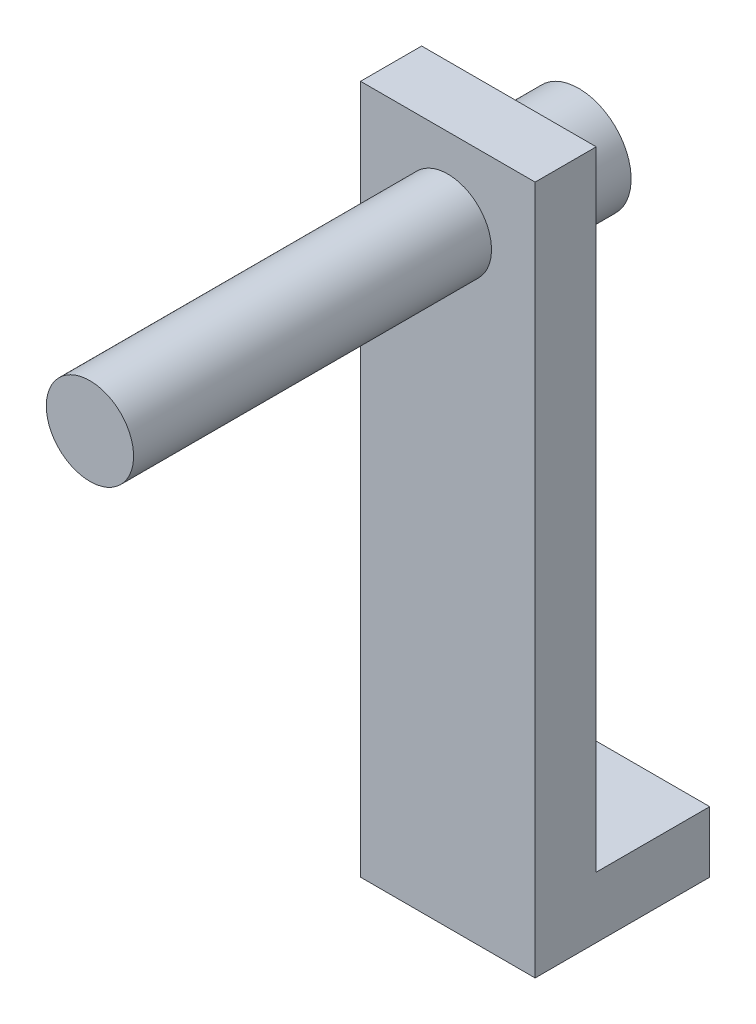
ISO-10303-21;
HEADER;
FILE_DESCRIPTION(('STEP AP214'),'2;1');
FILE_NAME('part.step','',(''),(''),'','','');
FILE_SCHEMA(('AUTOMOTIVE_DESIGN { 1 0 10303 214 1 1 1 1 }'));
ENDSEC;
DATA;
#1=APPLICATION_CONTEXT('core data for automotive mechanical design processes');
#2=APPLICATION_PROTOCOL_DEFINITION('international standard','automotive_design',2000,#1);
#3=PRODUCT_CONTEXT('',#1,'mechanical');
#4=PRODUCT('Part','Part','',(#3));
#5=PRODUCT_RELATED_PRODUCT_CATEGORY('part','',(#4));
#6=PRODUCT_DEFINITION_FORMATION('','',#4);
#7=PRODUCT_DEFINITION_CONTEXT('part definition',#1,'design');
#8=PRODUCT_DEFINITION('design','',#6,#7);
#9=PRODUCT_DEFINITION_SHAPE('','',#8);
#10=(LENGTH_UNIT() NAMED_UNIT(*) SI_UNIT(.MILLI.,.METRE.));
#11=(NAMED_UNIT(*) PLANE_ANGLE_UNIT() SI_UNIT($,.RADIAN.));
#12=(NAMED_UNIT(*) SI_UNIT($,.STERADIAN.) SOLID_ANGLE_UNIT());
#13=UNCERTAINTY_MEASURE_WITH_UNIT(LENGTH_MEASURE(1.E-05),#10,'distance_accuracy_value','');
#14=(GEOMETRIC_REPRESENTATION_CONTEXT(3) GLOBAL_UNCERTAINTY_ASSIGNED_CONTEXT((#13)) GLOBAL_UNIT_ASSIGNED_CONTEXT((#10,
#11,#12)) REPRESENTATION_CONTEXT('',''));
#15=CARTESIAN_POINT('',(0.,0.,0.));
#16=DIRECTION('',(0.,0.,1.));
#17=DIRECTION('',(1.,0.,0.));
#18=AXIS2_PLACEMENT_3D('',#15,#16,#17);
#19=CARTESIAN_POINT('',(-10.,7.,-10.));
#20=DIRECTION('',(1.,0.,0.));
#21=DIRECTION('',(0.,0.,-1.));
#22=AXIS2_PLACEMENT_3D('',#19,#20,#21);
#23=PLANE('',#22);
#24=DIRECTION('',(0.,0.,1.));
#25=VECTOR('',#24,1.);
#26=CARTESIAN_POINT('',(-10.,0.,-10.));
#27=LINE('',#26,#25);
#28=CARTESIAN_POINT('',(-10.,0.,-10.));
#29=VERTEX_POINT('',#28);
#30=CARTESIAN_POINT('',(-10.,0.,10.));
#31=VERTEX_POINT('',#30);
#32=EDGE_CURVE('E129',#29,#31,#27,.T.);
#33=ORIENTED_EDGE('',*,*,#32,.T.);
#34=DIRECTION('',(0.,-1.,0.));
#35=VECTOR('',#34,1.);
#36=CARTESIAN_POINT('',(-10.,7.,10.));
#37=LINE('',#36,#35);
#38=CARTESIAN_POINT('',(-10.,78.96,10.));
#39=VERTEX_POINT('',#38);
#40=EDGE_CURVE('E11',#39,#31,#37,.T.);
#41=ORIENTED_EDGE('',*,*,#40,.F.);
#42=DIRECTION('',(0.,0.,-1.));
#43=VECTOR('',#42,1.);
#44=CARTESIAN_POINT('',(-10.,78.96,10.));
#45=LINE('',#44,#43);
#46=CARTESIAN_POINT('',(-10.,78.96,3.));
#47=VERTEX_POINT('',#46);
#48=EDGE_CURVE('E109',#39,#47,#45,.T.);
#49=ORIENTED_EDGE('',*,*,#48,.T.);
#50=DIRECTION('',(0.,-1.,0.));
#51=VECTOR('',#50,1.);
#52=CARTESIAN_POINT('',(-10.,78.96,3.));
#53=LINE('',#52,#51);
#54=CARTESIAN_POINT('',(-10.,7.,3.));
#55=VERTEX_POINT('',#54);
#56=EDGE_CURVE('E124',#47,#55,#53,.T.);
#57=ORIENTED_EDGE('',*,*,#56,.T.);
#58=DIRECTION('',(0.,0.,1.));
#59=VECTOR('',#58,1.);
#60=CARTESIAN_POINT('',(-10.,7.,-10.));
#61=LINE('',#60,#59);
#62=CARTESIAN_POINT('',(-10.,7.,-10.));
#63=VERTEX_POINT('',#62);
#64=EDGE_CURVE('E61',#63,#55,#61,.T.);
#65=ORIENTED_EDGE('',*,*,#64,.F.);
#66=DIRECTION('',(0.,-1.,0.));
#67=VECTOR('',#66,1.);
#68=CARTESIAN_POINT('',(-10.,7.,-10.));
#69=LINE('',#68,#67);
#70=EDGE_CURVE('E136',#63,#29,#69,.T.);
#71=ORIENTED_EDGE('',*,*,#70,.T.);
#72=EDGE_LOOP('',(#33,#41,#49,#57,#65,#71));
#73=FACE_BOUND('',#72,.T.);
#74=ADVANCED_FACE('F42',(#73),#23,.F.);
#75=CARTESIAN_POINT('',(-10.,7.,10.));
#76=DIRECTION('',(0.,0.,-1.));
#77=DIRECTION('',(-1.,0.,0.));
#78=AXIS2_PLACEMENT_3D('',#75,#76,#77);
#79=PLANE('',#78);
#80=CARTESIAN_POINT('',(0.,69.76,10.));
#81=DIRECTION('',(0.,0.,-1.));
#82=DIRECTION('',(-1.,0.,0.));
#83=AXIS2_PLACEMENT_3D('',#80,#81,#82);
#84=CIRCLE('',#83,5.);
#85=CARTESIAN_POINT('',(-5.,69.76,10.));
#86=VERTEX_POINT('',#85);
#87=EDGE_CURVE('E114',#86,#86,#84,.T.);
#88=ORIENTED_EDGE('',*,*,#87,.T.);
#89=EDGE_LOOP('',(#88));
#90=FACE_BOUND('',#89,.T.);
#91=DIRECTION('',(1.,0.,0.));
#92=VECTOR('',#91,1.);
#93=CARTESIAN_POINT('',(-10.,0.,10.));
#94=LINE('',#93,#92);
#95=CARTESIAN_POINT('',(10.,0.,10.));
#96=VERTEX_POINT('',#95);
#97=EDGE_CURVE('E96',#31,#96,#94,.T.);
#98=ORIENTED_EDGE('',*,*,#97,.T.);
#99=DIRECTION('',(0.,-1.,0.));
#100=VECTOR('',#99,1.);
#101=CARTESIAN_POINT('',(10.,7.,10.));
#102=LINE('',#101,#100);
#103=CARTESIAN_POINT('',(10.,78.96,10.));
#104=VERTEX_POINT('',#103);
#105=EDGE_CURVE('E49',#104,#96,#102,.T.);
#106=ORIENTED_EDGE('',*,*,#105,.F.);
#107=DIRECTION('',(-1.,0.,0.));
#108=VECTOR('',#107,1.);
#109=CARTESIAN_POINT('',(10.,78.96,10.));
#110=LINE('',#109,#108);
#111=EDGE_CURVE('E94',#104,#39,#110,.T.);
#112=ORIENTED_EDGE('',*,*,#111,.T.);
#113=ORIENTED_EDGE('',*,*,#40,.T.);
#114=EDGE_LOOP('',(#98,#106,#112,#113));
#115=FACE_BOUND('',#114,.T.);
#116=ADVANCED_FACE('F93',(#90,#115),#79,.F.);
#117=CARTESIAN_POINT('',(10.,7.,-10.));
#118=DIRECTION('',(-1.,0.,0.));
#119=DIRECTION('',(0.,0.,1.));
#120=AXIS2_PLACEMENT_3D('',#117,#118,#119);
#121=PLANE('',#120);
#122=DIRECTION('',(0.,0.,-1.));
#123=VECTOR('',#122,1.);
#124=CARTESIAN_POINT('',(10.,7.,-10.));
#125=LINE('',#124,#123);
#126=CARTESIAN_POINT('',(10.,7.,3.));
#127=VERTEX_POINT('',#126);
#128=CARTESIAN_POINT('',(10.,7.,-10.));
#129=VERTEX_POINT('',#128);
#130=EDGE_CURVE('E131',#127,#129,#125,.T.);
#131=ORIENTED_EDGE('',*,*,#130,.F.);
#132=DIRECTION('',(0.,-1.,0.));
#133=VECTOR('',#132,1.);
#134=CARTESIAN_POINT('',(10.,78.96,3.));
#135=LINE('',#134,#133);
#136=CARTESIAN_POINT('',(10.,78.96,3.));
#137=VERTEX_POINT('',#136);
#138=EDGE_CURVE('E113',#137,#127,#135,.T.);
#139=ORIENTED_EDGE('',*,*,#138,.F.);
#140=DIRECTION('',(0.,0.,1.));
#141=VECTOR('',#140,1.);
#142=CARTESIAN_POINT('',(10.,78.96,10.));
#143=LINE('',#142,#141);
#144=EDGE_CURVE('E106',#137,#104,#143,.T.);
#145=ORIENTED_EDGE('',*,*,#144,.T.);
#146=ORIENTED_EDGE('',*,*,#105,.T.);
#147=DIRECTION('',(0.,0.,-1.));
#148=VECTOR('',#147,1.);
#149=CARTESIAN_POINT('',(10.,0.,-10.));
#150=LINE('',#149,#148);
#151=CARTESIAN_POINT('',(10.,0.,-10.));
#152=VERTEX_POINT('',#151);
#153=EDGE_CURVE('E139',#96,#152,#150,.T.);
#154=ORIENTED_EDGE('',*,*,#153,.T.);
#155=DIRECTION('',(0.,-1.,0.));
#156=VECTOR('',#155,1.);
#157=CARTESIAN_POINT('',(10.,7.,-10.));
#158=LINE('',#157,#156);
#159=EDGE_CURVE('E100',#129,#152,#158,.T.);
#160=ORIENTED_EDGE('',*,*,#159,.F.);
#161=EDGE_LOOP('',(#131,#139,#145,#146,#154,#160));
#162=FACE_BOUND('',#161,.T.);
#163=ADVANCED_FACE('F111',(#162),#121,.F.);
#164=CARTESIAN_POINT('',(-10.,7.,-10.));
#165=DIRECTION('',(0.,0.,1.));
#166=DIRECTION('',(1.,0.,0.));
#167=AXIS2_PLACEMENT_3D('',#164,#165,#166);
#168=PLANE('',#167);
#169=DIRECTION('',(-1.,0.,0.));
#170=VECTOR('',#169,1.);
#171=CARTESIAN_POINT('',(-10.,0.,-10.));
#172=LINE('',#171,#170);
#173=EDGE_CURVE('E132',#152,#29,#172,.T.);
#174=ORIENTED_EDGE('',*,*,#173,.T.);
#175=ORIENTED_EDGE('',*,*,#70,.F.);
#176=DIRECTION('',(-1.,0.,0.));
#177=VECTOR('',#176,1.);
#178=CARTESIAN_POINT('',(-10.,7.,-10.));
#179=LINE('',#178,#177);
#180=EDGE_CURVE('E134',#129,#63,#179,.T.);
#181=ORIENTED_EDGE('',*,*,#180,.F.);
#182=ORIENTED_EDGE('',*,*,#159,.T.);
#183=EDGE_LOOP('',(#174,#175,#181,#182));
#184=FACE_BOUND('',#183,.T.);
#185=ADVANCED_FACE('F149',(#184),#168,.F.);
#186=CARTESIAN_POINT('',(0.,7.,0.));
#187=DIRECTION('',(0.,1.,0.));
#188=DIRECTION('',(0.,0.,1.));
#189=AXIS2_PLACEMENT_3D('',#186,#187,#188);
#190=PLANE('',#189);
#191=DIRECTION('',(-1.,0.,0.));
#192=VECTOR('',#191,1.);
#193=CARTESIAN_POINT('',(0.,7.,3.));
#194=LINE('',#193,#192);
#195=EDGE_CURVE('E56',#127,#55,#194,.T.);
#196=ORIENTED_EDGE('',*,*,#195,.F.);
#197=ORIENTED_EDGE('',*,*,#130,.T.);
#198=ORIENTED_EDGE('',*,*,#180,.T.);
#199=ORIENTED_EDGE('',*,*,#64,.T.);
#200=EDGE_LOOP('',(#196,#197,#198,#199));
#201=FACE_BOUND('',#200,.T.);
#202=ADVANCED_FACE('F166',(#201),#190,.T.);
#203=CARTESIAN_POINT('',(0.,0.,0.));
#204=DIRECTION('',(0.,1.,0.));
#205=DIRECTION('',(0.,0.,1.));
#206=AXIS2_PLACEMENT_3D('',#203,#204,#205);
#207=PLANE('',#206);
#208=ORIENTED_EDGE('',*,*,#173,.F.);
#209=ORIENTED_EDGE('',*,*,#153,.F.);
#210=ORIENTED_EDGE('',*,*,#97,.F.);
#211=ORIENTED_EDGE('',*,*,#32,.F.);
#212=EDGE_LOOP('',(#208,#209,#210,#211));
#213=FACE_BOUND('',#212,.T.);
#214=ADVANCED_FACE('F153',(#213),#207,.F.);
#215=CARTESIAN_POINT('',(10.,78.96,3.));
#216=DIRECTION('',(0.,0.,-1.));
#217=DIRECTION('',(-1.,0.,0.));
#218=AXIS2_PLACEMENT_3D('',#215,#216,#217);
#219=PLANE('',#218);
#220=CARTESIAN_POINT('',(0.,69.76,3.));
#221=DIRECTION('',(0.,0.,-1.));
#222=DIRECTION('',(-1.,0.,0.));
#223=AXIS2_PLACEMENT_3D('',#220,#221,#222);
#224=CIRCLE('',#223,5.99742860643125);
#225=CARTESIAN_POINT('',(-5.99742860643125,69.76,3.));
#226=VERTEX_POINT('',#225);
#227=EDGE_CURVE('E301',#226,#226,#224,.T.);
#228=ORIENTED_EDGE('',*,*,#227,.F.);
#229=EDGE_LOOP('',(#228));
#230=FACE_BOUND('',#229,.T.);
#231=ORIENTED_EDGE('',*,*,#138,.T.);
#232=ORIENTED_EDGE('',*,*,#195,.T.);
#233=ORIENTED_EDGE('',*,*,#56,.F.);
#234=DIRECTION('',(1.,0.,0.));
#235=VECTOR('',#234,1.);
#236=CARTESIAN_POINT('',(10.,78.96,3.));
#237=LINE('',#236,#235);
#238=EDGE_CURVE('E122',#47,#137,#237,.T.);
#239=ORIENTED_EDGE('',*,*,#238,.T.);
#240=EDGE_LOOP('',(#231,#232,#233,#239));
#241=FACE_BOUND('',#240,.T.);
#242=ADVANCED_FACE('F156',(#230,#241),#219,.T.);
#243=CARTESIAN_POINT('',(0.,78.96,0.));
#244=DIRECTION('',(0.,1.,0.));
#245=DIRECTION('',(0.,0.,1.));
#246=AXIS2_PLACEMENT_3D('',#243,#244,#245);
#247=PLANE('',#246);
#248=ORIENTED_EDGE('',*,*,#144,.F.);
#249=ORIENTED_EDGE('',*,*,#238,.F.);
#250=ORIENTED_EDGE('',*,*,#48,.F.);
#251=ORIENTED_EDGE('',*,*,#111,.F.);
#252=EDGE_LOOP('',(#248,#249,#250,#251));
#253=FACE_BOUND('',#252,.T.);
#254=ADVANCED_FACE('F104',(#253),#247,.T.);
#255=CARTESIAN_POINT('',(0.,69.76,51.));
#256=DIRECTION('',(0.,0.,-1.));
#257=DIRECTION('',(-1.,0.,0.));
#258=AXIS2_PLACEMENT_3D('',#255,#256,#257);
#259=CYLINDRICAL_SURFACE('',#258,5.);
#260=CARTESIAN_POINT('',(0.,69.76,51.));
#261=DIRECTION('',(0.,0.,-1.));
#262=DIRECTION('',(-1.,0.,0.));
#263=AXIS2_PLACEMENT_3D('',#260,#261,#262);
#264=CIRCLE('',#263,5.);
#265=CARTESIAN_POINT('',(-5.,69.76,51.));
#266=VERTEX_POINT('',#265);
#267=EDGE_CURVE('E117',#266,#266,#264,.T.);
#268=ORIENTED_EDGE('',*,*,#267,.T.);
#269=EDGE_LOOP('',(#268));
#270=FACE_BOUND('',#269,.T.);
#271=ORIENTED_EDGE('',*,*,#87,.F.);
#272=EDGE_LOOP('',(#271));
#273=FACE_BOUND('',#272,.T.);
#274=ADVANCED_FACE('F164',(#270,#273),#259,.T.);
#275=CARTESIAN_POINT('',(0.,69.76,51.));
#276=DIRECTION('',(0.,0.,-1.));
#277=DIRECTION('',(-1.,0.,0.));
#278=AXIS2_PLACEMENT_3D('',#275,#276,#277);
#279=PLANE('',#278);
#280=ORIENTED_EDGE('',*,*,#267,.F.);
#281=EDGE_LOOP('',(#280));
#282=FACE_BOUND('',#281,.T.);
#283=ADVANCED_FACE('F217',(#282),#279,.F.);
#284=CARTESIAN_POINT('',(0.,69.76,-5.));
#285=DIRECTION('',(0.,0.,1.));
#286=DIRECTION('',(1.,0.,0.));
#287=AXIS2_PLACEMENT_3D('',#284,#285,#286);
#288=CYLINDRICAL_SURFACE('',#287,5.99742860643125);
#289=CARTESIAN_POINT('',(0.,69.76,-5.));
#290=DIRECTION('',(0.,0.,-1.));
#291=DIRECTION('',(-1.,0.,0.));
#292=AXIS2_PLACEMENT_3D('',#289,#290,#291);
#293=CIRCLE('',#292,5.99742860643125);
#294=CARTESIAN_POINT('',(-5.99742860643125,69.76,-5.));
#295=VERTEX_POINT('',#294);
#296=EDGE_CURVE('E300',#295,#295,#293,.T.);
#297=ORIENTED_EDGE('',*,*,#296,.F.);
#298=EDGE_LOOP('',(#297));
#299=FACE_BOUND('',#298,.T.);
#300=ORIENTED_EDGE('',*,*,#227,.T.);
#301=EDGE_LOOP('',(#300));
#302=FACE_BOUND('',#301,.T.);
#303=ADVANCED_FACE('F228',(#299,#302),#288,.T.);
#304=CARTESIAN_POINT('',(0.,69.76,-5.));
#305=DIRECTION('',(0.,0.,-1.));
#306=DIRECTION('',(-1.,0.,0.));
#307=AXIS2_PLACEMENT_3D('',#304,#305,#306);
#308=PLANE('',#307);
#309=ORIENTED_EDGE('',*,*,#296,.T.);
#310=EDGE_LOOP('',(#309));
#311=FACE_BOUND('',#310,.T.);
#312=ADVANCED_FACE('F244',(#311),#308,.T.);
#313=CLOSED_SHELL('',(#74,#116,#163,#185,#202,#214,#242,#254,#274,#283,#303,#312));
#314=MANIFOLD_SOLID_BREP('B2',#313);
#315=ADVANCED_BREP_SHAPE_REPRESENTATION('',(#18,#314),#14);
#316=SHAPE_DEFINITION_REPRESENTATION(#9,#315);
ENDSEC;
END-ISO-10303-21;
